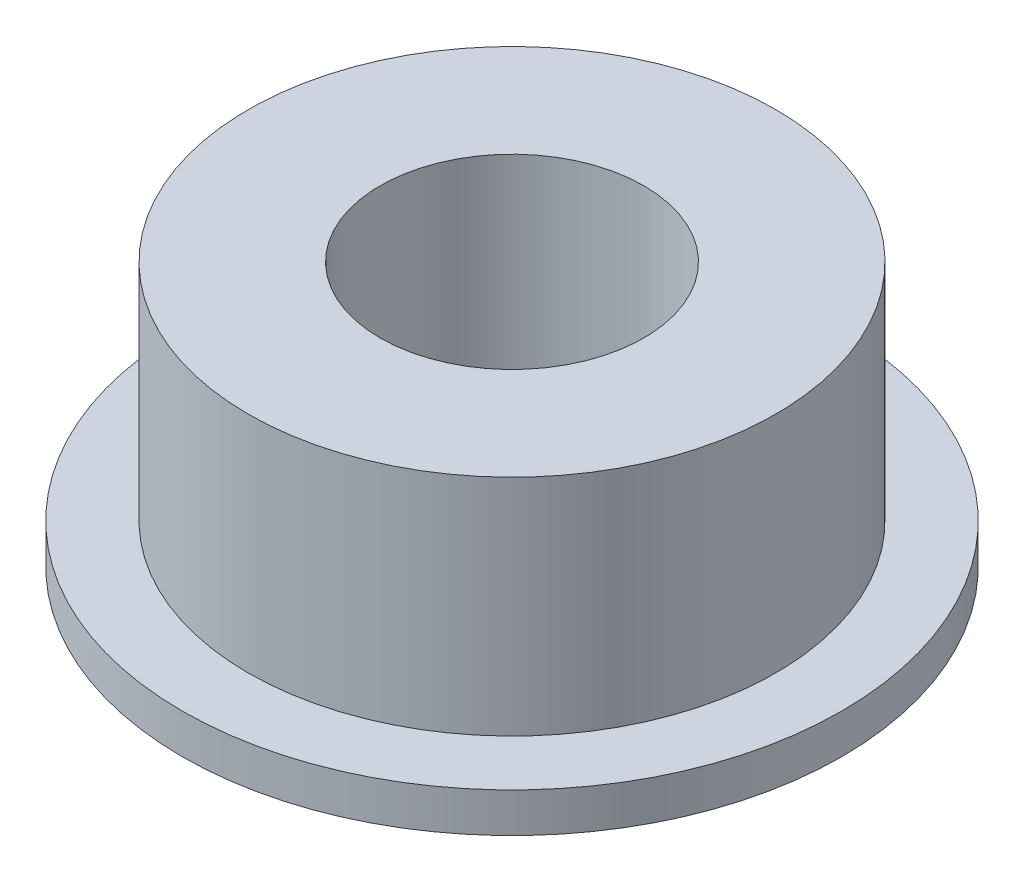
ISO-10303-21;
HEADER;
FILE_DESCRIPTION(('STEP AP214'),'2;1');
FILE_NAME('part.step','',(''),(''),'','','');
FILE_SCHEMA(('AUTOMOTIVE_DESIGN { 1 0 10303 214 1 1 1 1 }'));
ENDSEC;
DATA;
#1=APPLICATION_CONTEXT('core data for automotive mechanical design processes');
#2=APPLICATION_PROTOCOL_DEFINITION('international standard','automotive_design',2000,#1);
#3=PRODUCT_CONTEXT('',#1,'mechanical');
#4=PRODUCT('Part','Part','',(#3));
#5=PRODUCT_RELATED_PRODUCT_CATEGORY('part','',(#4));
#6=PRODUCT_DEFINITION_FORMATION('','',#4);
#7=PRODUCT_DEFINITION_CONTEXT('part definition',#1,'design');
#8=PRODUCT_DEFINITION('design','',#6,#7);
#9=PRODUCT_DEFINITION_SHAPE('','',#8);
#10=(LENGTH_UNIT() NAMED_UNIT(*) SI_UNIT(.MILLI.,.METRE.));
#11=(NAMED_UNIT(*) PLANE_ANGLE_UNIT() SI_UNIT($,.RADIAN.));
#12=(NAMED_UNIT(*) SI_UNIT($,.STERADIAN.) SOLID_ANGLE_UNIT());
#13=UNCERTAINTY_MEASURE_WITH_UNIT(LENGTH_MEASURE(1.E-05),#10,'distance_accuracy_value','');
#14=(GEOMETRIC_REPRESENTATION_CONTEXT(3) GLOBAL_UNCERTAINTY_ASSIGNED_CONTEXT((#13)) GLOBAL_UNIT_ASSIGNED_CONTEXT((#10,
#11,#12)) REPRESENTATION_CONTEXT('',''));
#15=CARTESIAN_POINT('',(0.,0.,0.));
#16=DIRECTION('',(0.,0.,1.));
#17=DIRECTION('',(1.,0.,0.));
#18=AXIS2_PLACEMENT_3D('',#15,#16,#17);
#19=CARTESIAN_POINT('',(0.,3.,0.));
#20=DIRECTION('',(0.,-1.,0.));
#21=DIRECTION('',(0.,0.,-1.));
#22=AXIS2_PLACEMENT_3D('',#19,#20,#21);
#23=CYLINDRICAL_SURFACE('',#22,4.);
#24=CARTESIAN_POINT('',(0.,0.6,0.));
#25=DIRECTION('',(0.,-1.,0.));
#26=DIRECTION('',(0.,0.,-1.));
#27=AXIS2_PLACEMENT_3D('',#24,#25,#26);
#28=CIRCLE('',#27,4.);
#29=CARTESIAN_POINT('',(0.,0.6,-4.));
#30=VERTEX_POINT('',#29);
#31=EDGE_CURVE('E10',#30,#30,#28,.T.);
#32=ORIENTED_EDGE('',*,*,#31,.F.);
#33=EDGE_LOOP('',(#32));
#34=FACE_BOUND('',#33,.T.);
#35=CARTESIAN_POINT('',(0.,4.,0.));
#36=DIRECTION('',(0.,1.,0.));
#37=DIRECTION('',(0.,0.,1.));
#38=AXIS2_PLACEMENT_3D('',#35,#36,#37);
#39=CIRCLE('',#38,4.);
#40=CARTESIAN_POINT('',(0.,4.,4.));
#41=VERTEX_POINT('',#40);
#42=EDGE_CURVE('E47',#41,#41,#39,.T.);
#43=ORIENTED_EDGE('',*,*,#42,.F.);
#44=EDGE_LOOP('',(#43));
#45=FACE_BOUND('',#44,.T.);
#46=ADVANCED_FACE('F32',(#34,#45),#23,.T.);
#47=CARTESIAN_POINT('',(0.,0.,0.));
#48=DIRECTION('',(0.,1.,0.));
#49=DIRECTION('',(0.,0.,1.));
#50=AXIS2_PLACEMENT_3D('',#47,#48,#49);
#51=PLANE('',#50);
#52=CARTESIAN_POINT('',(0.,0.,0.));
#53=DIRECTION('',(0.,1.,0.));
#54=DIRECTION('',(0.,0.,1.));
#55=AXIS2_PLACEMENT_3D('',#52,#53,#54);
#56=CIRCLE('',#55,2.);
#57=CARTESIAN_POINT('',(0.,0.,2.));
#58=VERTEX_POINT('',#57);
#59=EDGE_CURVE('E35',#58,#58,#56,.T.);
#60=ORIENTED_EDGE('',*,*,#59,.T.);
#61=EDGE_LOOP('',(#60));
#62=FACE_BOUND('',#61,.T.);
#63=CARTESIAN_POINT('',(0.,0.,0.));
#64=DIRECTION('',(0.,-1.,0.));
#65=DIRECTION('',(0.,0.,-1.));
#66=AXIS2_PLACEMENT_3D('',#63,#64,#65);
#67=CIRCLE('',#66,5.);
#68=CARTESIAN_POINT('',(0.,0.,-5.));
#69=VERTEX_POINT('',#68);
#70=EDGE_CURVE('E44',#69,#69,#67,.T.);
#71=ORIENTED_EDGE('',*,*,#70,.T.);
#72=EDGE_LOOP('',(#71));
#73=FACE_BOUND('',#72,.T.);
#74=ADVANCED_FACE('F71',(#62,#73),#51,.F.);
#75=CARTESIAN_POINT('',(0.,3.,0.));
#76=DIRECTION('',(0.,-1.,0.));
#77=DIRECTION('',(0.,0.,-1.));
#78=AXIS2_PLACEMENT_3D('',#75,#76,#77);
#79=CYLINDRICAL_SURFACE('',#78,2.);
#80=ORIENTED_EDGE('',*,*,#59,.F.);
#81=EDGE_LOOP('',(#80));
#82=FACE_BOUND('',#81,.T.);
#83=CARTESIAN_POINT('',(0.,4.,0.));
#84=DIRECTION('',(0.,1.,0.));
#85=DIRECTION('',(0.,0.,1.));
#86=AXIS2_PLACEMENT_3D('',#83,#84,#85);
#87=CIRCLE('',#86,2.);
#88=CARTESIAN_POINT('',(0.,4.,2.));
#89=VERTEX_POINT('',#88);
#90=EDGE_CURVE('E52',#89,#89,#87,.T.);
#91=ORIENTED_EDGE('',*,*,#90,.T.);
#92=EDGE_LOOP('',(#91));
#93=FACE_BOUND('',#92,.T.);
#94=ADVANCED_FACE('F56',(#82,#93),#79,.F.);
#95=CARTESIAN_POINT('',(0.,0.6,0.));
#96=DIRECTION('',(0.,-1.,0.));
#97=DIRECTION('',(0.,0.,-1.));
#98=AXIS2_PLACEMENT_3D('',#95,#96,#97);
#99=PLANE('',#98);
#100=CARTESIAN_POINT('',(0.,0.6,0.));
#101=DIRECTION('',(0.,-1.,0.));
#102=DIRECTION('',(0.,0.,-1.));
#103=AXIS2_PLACEMENT_3D('',#100,#101,#102);
#104=CIRCLE('',#103,5.);
#105=CARTESIAN_POINT('',(0.,0.6,-5.));
#106=VERTEX_POINT('',#105);
#107=EDGE_CURVE('E42',#106,#106,#104,.T.);
#108=ORIENTED_EDGE('',*,*,#107,.F.);
#109=EDGE_LOOP('',(#108));
#110=FACE_BOUND('',#109,.T.);
#111=ORIENTED_EDGE('',*,*,#31,.T.);
#112=EDGE_LOOP('',(#111));
#113=FACE_BOUND('',#112,.T.);
#114=ADVANCED_FACE('F66',(#110,#113),#99,.F.);
#115=CARTESIAN_POINT('',(0.,0.6,0.));
#116=DIRECTION('',(0.,-1.,0.));
#117=DIRECTION('',(0.,0.,-1.));
#118=AXIS2_PLACEMENT_3D('',#115,#116,#117);
#119=CYLINDRICAL_SURFACE('',#118,5.);
#120=ORIENTED_EDGE('',*,*,#107,.T.);
#121=EDGE_LOOP('',(#120));
#122=FACE_BOUND('',#121,.T.);
#123=ORIENTED_EDGE('',*,*,#70,.F.);
#124=EDGE_LOOP('',(#123));
#125=FACE_BOUND('',#124,.T.);
#126=ADVANCED_FACE('F60',(#122,#125),#119,.T.);
#127=CARTESIAN_POINT('',(0.,4.,0.));
#128=DIRECTION('',(0.,1.,0.));
#129=DIRECTION('',(0.,0.,1.));
#130=AXIS2_PLACEMENT_3D('',#127,#128,#129);
#131=PLANE('',#130);
#132=ORIENTED_EDGE('',*,*,#42,.T.);
#133=EDGE_LOOP('',(#132));
#134=FACE_BOUND('',#133,.T.);
#135=ORIENTED_EDGE('',*,*,#90,.F.);
#136=EDGE_LOOP('',(#135));
#137=FACE_BOUND('',#136,.T.);
#138=ADVANCED_FACE('F58',(#134,#137),#131,.T.);
#139=CLOSED_SHELL('',(#46,#74,#94,#114,#126,#138));
#140=MANIFOLD_SOLID_BREP('B2',#139);
#141=ADVANCED_BREP_SHAPE_REPRESENTATION('',(#18,#140),#14);
#142=SHAPE_DEFINITION_REPRESENTATION(#9,#141);
ENDSEC;
END-ISO-10303-21;
